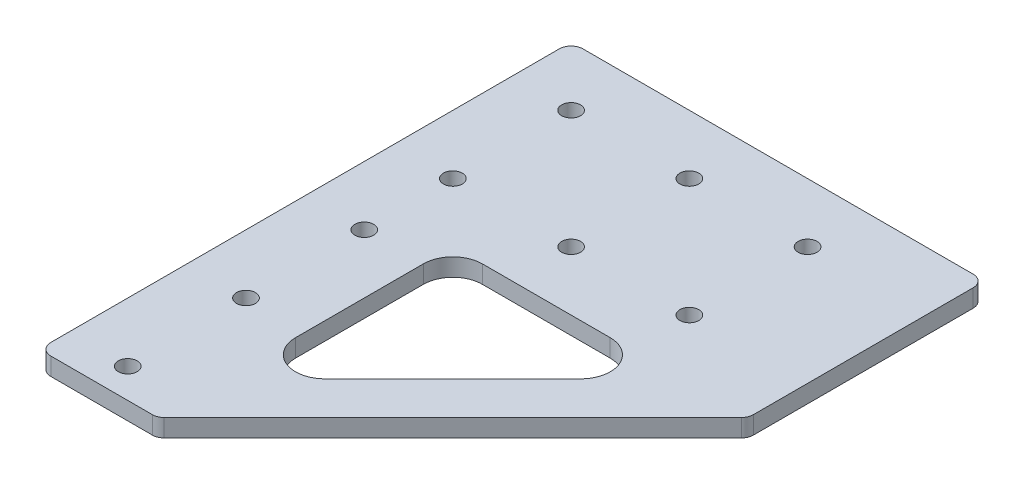
ISO-10303-21;
HEADER;
FILE_DESCRIPTION(('STEP AP214'),'2;1');
FILE_NAME('part.step','',(''),(''),'','','');
FILE_SCHEMA(('AUTOMOTIVE_DESIGN { 1 0 10303 214 1 1 1 1 }'));
ENDSEC;
DATA;
#1=APPLICATION_CONTEXT('core data for automotive mechanical design processes');
#2=APPLICATION_PROTOCOL_DEFINITION('international standard','automotive_design',2000,#1);
#3=PRODUCT_CONTEXT('',#1,'mechanical');
#4=PRODUCT('Part','Part','',(#3));
#5=PRODUCT_RELATED_PRODUCT_CATEGORY('part','',(#4));
#6=PRODUCT_DEFINITION_FORMATION('','',#4);
#7=PRODUCT_DEFINITION_CONTEXT('part definition',#1,'design');
#8=PRODUCT_DEFINITION('design','',#6,#7);
#9=PRODUCT_DEFINITION_SHAPE('','',#8);
#10=(LENGTH_UNIT() NAMED_UNIT(*) SI_UNIT(.MILLI.,.METRE.));
#11=(NAMED_UNIT(*) PLANE_ANGLE_UNIT() SI_UNIT($,.RADIAN.));
#12=(NAMED_UNIT(*) SI_UNIT($,.STERADIAN.) SOLID_ANGLE_UNIT());
#13=UNCERTAINTY_MEASURE_WITH_UNIT(LENGTH_MEASURE(1.E-05),#10,'distance_accuracy_value','');
#14=(GEOMETRIC_REPRESENTATION_CONTEXT(3) GLOBAL_UNCERTAINTY_ASSIGNED_CONTEXT((#13)) GLOBAL_UNIT_ASSIGNED_CONTEXT((#10,
#11,#12)) REPRESENTATION_CONTEXT('',''));
#15=CARTESIAN_POINT('',(0.,0.,0.));
#16=DIRECTION('',(0.,0.,1.));
#17=DIRECTION('',(1.,0.,0.));
#18=AXIS2_PLACEMENT_3D('',#15,#16,#17);
#19=CARTESIAN_POINT('',(0.,3.,0.));
#20=DIRECTION('',(0.,-1.,0.));
#21=DIRECTION('',(0.,0.,-1.));
#22=AXIS2_PLACEMENT_3D('',#19,#20,#21);
#23=PLANE('',#22);
#24=DIRECTION('',(0.,0.,1.));
#25=VECTOR('',#24,1.);
#26=CARTESIAN_POINT('',(-20.,3.,50.));
#27=LINE('',#26,#25);
#28=CARTESIAN_POINT('',(-20.,3.,-38.));
#29=VERTEX_POINT('',#28);
#30=CARTESIAN_POINT('',(-20.,3.,48.));
#31=VERTEX_POINT('',#30);
#32=EDGE_CURVE('E289',#29,#31,#27,.T.);
#33=ORIENTED_EDGE('',*,*,#32,.T.);
#34=CARTESIAN_POINT('',(-18.,3.,48.));
#35=DIRECTION('',(0.,-1.,0.));
#36=DIRECTION('',(0.,0.,-1.));
#37=AXIS2_PLACEMENT_3D('',#34,#35,#36);
#38=CIRCLE('',#37,2.);
#39=CARTESIAN_POINT('',(-18.,3.,50.));
#40=VERTEX_POINT('',#39);
#41=EDGE_CURVE('E213',#31,#40,#38,.F.);
#42=ORIENTED_EDGE('',*,*,#41,.T.);
#43=DIRECTION('',(1.,0.,0.));
#44=VECTOR('',#43,1.);
#45=CARTESIAN_POINT('',(0.,3.,50.));
#46=LINE('',#45,#44);
#47=CARTESIAN_POINT('',(-0.828427124746185,3.,50.));
#48=VERTEX_POINT('',#47);
#49=EDGE_CURVE('E178',#40,#48,#46,.T.);
#50=ORIENTED_EDGE('',*,*,#49,.T.);
#51=CARTESIAN_POINT('',(-0.828427124746185,3.,48.));
#52=DIRECTION('',(0.,-1.,0.));
#53=DIRECTION('',(0.,0.,-1.));
#54=AXIS2_PLACEMENT_3D('',#51,#52,#53);
#55=CIRCLE('',#54,2.);
#56=CARTESIAN_POINT('',(0.585786437626911,3.,49.4142135623731));
#57=VERTEX_POINT('',#56);
#58=EDGE_CURVE('E205',#48,#57,#55,.F.);
#59=ORIENTED_EDGE('',*,*,#58,.T.);
#60=DIRECTION('',(0.707106781186547,0.,-0.707106781186548));
#61=VECTOR('',#60,1.);
#62=CARTESIAN_POINT('',(0.,3.,50.));
#63=LINE('',#62,#61);
#64=CARTESIAN_POINT('',(49.4142135623731,3.,0.585786437626919));
#65=VERTEX_POINT('',#64);
#66=EDGE_CURVE('E185',#57,#65,#63,.T.);
#67=ORIENTED_EDGE('',*,*,#66,.T.);
#68=CARTESIAN_POINT('',(48.,3.,-0.828427124746178));
#69=DIRECTION('',(0.,-1.,0.));
#70=DIRECTION('',(0.,0.,-1.));
#71=AXIS2_PLACEMENT_3D('',#68,#69,#70);
#72=CIRCLE('',#71,2.);
#73=CARTESIAN_POINT('',(50.,3.,-0.828427124746178));
#74=VERTEX_POINT('',#73);
#75=EDGE_CURVE('E207',#65,#74,#72,.F.);
#76=ORIENTED_EDGE('',*,*,#75,.T.);
#77=DIRECTION('',(0.,0.,-1.));
#78=VECTOR('',#77,1.);
#79=CARTESIAN_POINT('',(50.,3.,-40.));
#80=LINE('',#79,#78);
#81=CARTESIAN_POINT('',(50.,3.,-38.));
#82=VERTEX_POINT('',#81);
#83=EDGE_CURVE('E189',#74,#82,#80,.T.);
#84=ORIENTED_EDGE('',*,*,#83,.T.);
#85=CARTESIAN_POINT('',(48.,3.,-38.));
#86=DIRECTION('',(0.,-1.,0.));
#87=DIRECTION('',(0.,0.,-1.));
#88=AXIS2_PLACEMENT_3D('',#85,#86,#87);
#89=CIRCLE('',#88,2.);
#90=CARTESIAN_POINT('',(48.,3.,-40.));
#91=VERTEX_POINT('',#90);
#92=EDGE_CURVE('E209',#82,#91,#89,.F.);
#93=ORIENTED_EDGE('',*,*,#92,.T.);
#94=DIRECTION('',(-1.,0.,0.));
#95=VECTOR('',#94,1.);
#96=CARTESIAN_POINT('',(-20.,3.,-40.));
#97=LINE('',#96,#95);
#98=CARTESIAN_POINT('',(-18.,3.,-40.));
#99=VERTEX_POINT('',#98);
#100=EDGE_CURVE('E286',#91,#99,#97,.T.);
#101=ORIENTED_EDGE('',*,*,#100,.T.);
#102=CARTESIAN_POINT('',(-18.,3.,-38.));
#103=DIRECTION('',(0.,-1.,0.));
#104=DIRECTION('',(0.,0.,-1.));
#105=AXIS2_PLACEMENT_3D('',#102,#103,#104);
#106=CIRCLE('',#105,2.);
#107=EDGE_CURVE('E211',#99,#29,#106,.F.);
#108=ORIENTED_EDGE('',*,*,#107,.T.);
#109=EDGE_LOOP('',(#33,#42,#50,#59,#67,#76,#84,#93,#101,#108));
#110=FACE_BOUND('',#109,.T.);
#111=DIRECTION('',(-1.,0.,0.));
#112=VECTOR('',#111,1.);
#113=CARTESIAN_POINT('',(0.,3.,0.));
#114=LINE('',#113,#112);
#115=CARTESIAN_POINT('',(26.6152236891498,3.,0.));
#116=VERTEX_POINT('',#115);
#117=CARTESIAN_POINT('',(5.,3.,0.));
#118=VERTEX_POINT('',#117);
#119=EDGE_CURVE('E278',#116,#118,#114,.T.);
#120=ORIENTED_EDGE('',*,*,#119,.F.);
#121=CARTESIAN_POINT('',(26.6152236891498,3.,5.));
#122=DIRECTION('',(0.,-1.,0.));
#123=DIRECTION('',(0.,0.,-1.));
#124=AXIS2_PLACEMENT_3D('',#121,#122,#123);
#125=CIRCLE('',#124,5.);
#126=CARTESIAN_POINT('',(30.1507575950825,3.,8.53553390593274));
#127=VERTEX_POINT('',#126);
#128=EDGE_CURVE('E11',#116,#127,#125,.T.);
#129=ORIENTED_EDGE('',*,*,#128,.T.);
#130=DIRECTION('',(0.707106781186547,0.,-0.707106781186548));
#131=VECTOR('',#130,1.);
#132=CARTESIAN_POINT('',(38.6862915010153,3.,0.));
#133=LINE('',#132,#131);
#134=CARTESIAN_POINT('',(8.53553390593274,3.,30.1507575950825));
#135=VERTEX_POINT('',#134);
#136=EDGE_CURVE('E269',#135,#127,#133,.T.);
#137=ORIENTED_EDGE('',*,*,#136,.F.);
#138=CARTESIAN_POINT('',(5.00000000000001,3.,26.6152236891498));
#139=DIRECTION('',(0.,-1.,0.));
#140=DIRECTION('',(0.,0.,-1.));
#141=AXIS2_PLACEMENT_3D('',#138,#139,#140);
#142=CIRCLE('',#141,5.);
#143=CARTESIAN_POINT('',(0.,3.,26.6152236891498));
#144=VERTEX_POINT('',#143);
#145=EDGE_CURVE('E250',#135,#144,#142,.T.);
#146=ORIENTED_EDGE('',*,*,#145,.T.);
#147=DIRECTION('',(0.,0.,1.));
#148=VECTOR('',#147,1.);
#149=CARTESIAN_POINT('',(0.,3.,38.6862915010153));
#150=LINE('',#149,#148);
#151=CARTESIAN_POINT('',(0.,3.,5.));
#152=VERTEX_POINT('',#151);
#153=EDGE_CURVE('E272',#152,#144,#150,.T.);
#154=ORIENTED_EDGE('',*,*,#153,.F.);
#155=CARTESIAN_POINT('',(5.,3.,5.));
#156=DIRECTION('',(0.,-1.,0.));
#157=DIRECTION('',(0.,0.,-1.));
#158=AXIS2_PLACEMENT_3D('',#155,#156,#157);
#159=CIRCLE('',#158,5.);
#160=EDGE_CURVE('E246',#152,#118,#159,.T.);
#161=ORIENTED_EDGE('',*,*,#160,.T.);
#162=EDGE_LOOP('',(#120,#129,#137,#146,#154,#161));
#163=FACE_BOUND('',#162,.T.);
#164=CARTESIAN_POINT('',(-10.,3.,5.));
#165=DIRECTION('',(0.,1.,0.));
#166=DIRECTION('',(0.,0.,1.));
#167=AXIS2_PLACEMENT_3D('',#164,#165,#166);
#168=CIRCLE('',#167,1.6);
#169=CARTESIAN_POINT('',(-10.,3.,6.6));
#170=VERTEX_POINT('',#169);
#171=EDGE_CURVE('E266',#170,#170,#168,.T.);
#172=ORIENTED_EDGE('',*,*,#171,.F.);
#173=EDGE_LOOP('',(#172));
#174=FACE_BOUND('',#173,.T.);
#175=CARTESIAN_POINT('',(-10.,3.,-9.99999999999999));
#176=DIRECTION('',(0.,1.,0.));
#177=DIRECTION('',(0.,0.,1.));
#178=AXIS2_PLACEMENT_3D('',#175,#176,#177);
#179=CIRCLE('',#178,1.6);
#180=CARTESIAN_POINT('',(-10.,3.,-8.39999999999999));
#181=VERTEX_POINT('',#180);
#182=EDGE_CURVE('E424',#181,#181,#179,.T.);
#183=ORIENTED_EDGE('',*,*,#182,.F.);
#184=EDGE_LOOP('',(#183));
#185=FACE_BOUND('',#184,.T.);
#186=CARTESIAN_POINT('',(-10.,3.,25.));
#187=DIRECTION('',(0.,1.,0.));
#188=DIRECTION('',(0.,0.,1.));
#189=AXIS2_PLACEMENT_3D('',#186,#187,#188);
#190=CIRCLE('',#189,1.6);
#191=CARTESIAN_POINT('',(-10.,3.,26.6));
#192=VERTEX_POINT('',#191);
#193=EDGE_CURVE('E418',#192,#192,#190,.T.);
#194=ORIENTED_EDGE('',*,*,#193,.F.);
#195=EDGE_LOOP('',(#194));
#196=FACE_BOUND('',#195,.T.);
#197=CARTESIAN_POINT('',(-10.,3.,45.));
#198=DIRECTION('',(0.,1.,0.));
#199=DIRECTION('',(0.,0.,1.));
#200=AXIS2_PLACEMENT_3D('',#197,#198,#199);
#201=CIRCLE('',#200,1.6);
#202=CARTESIAN_POINT('',(-10.,3.,46.6));
#203=VERTEX_POINT('',#202);
#204=EDGE_CURVE('E412',#203,#203,#201,.T.);
#205=ORIENTED_EDGE('',*,*,#204,.F.);
#206=EDGE_LOOP('',(#205));
#207=FACE_BOUND('',#206,.T.);
#208=CARTESIAN_POINT('',(-10.,3.,-30.));
#209=DIRECTION('',(0.,1.,0.));
#210=DIRECTION('',(0.,0.,1.));
#211=AXIS2_PLACEMENT_3D('',#208,#209,#210);
#212=CIRCLE('',#211,1.6);
#213=CARTESIAN_POINT('',(-10.,3.,-28.4));
#214=VERTEX_POINT('',#213);
#215=EDGE_CURVE('E406',#214,#214,#212,.T.);
#216=ORIENTED_EDGE('',*,*,#215,.F.);
#217=EDGE_LOOP('',(#216));
#218=FACE_BOUND('',#217,.T.);
#219=CARTESIAN_POINT('',(10.,3.,-9.99999999999999));
#220=DIRECTION('',(0.,1.,0.));
#221=DIRECTION('',(0.,0.,1.));
#222=AXIS2_PLACEMENT_3D('',#219,#220,#221);
#223=CIRCLE('',#222,1.6);
#224=CARTESIAN_POINT('',(10.,3.,-8.39999999999999));
#225=VERTEX_POINT('',#224);
#226=EDGE_CURVE('E400',#225,#225,#223,.T.);
#227=ORIENTED_EDGE('',*,*,#226,.F.);
#228=EDGE_LOOP('',(#227));
#229=FACE_BOUND('',#228,.T.);
#230=CARTESIAN_POINT('',(10.,3.,-30.));
#231=DIRECTION('',(0.,1.,0.));
#232=DIRECTION('',(0.,0.,1.));
#233=AXIS2_PLACEMENT_3D('',#230,#231,#232);
#234=CIRCLE('',#233,1.6);
#235=CARTESIAN_POINT('',(10.,3.,-28.4));
#236=VERTEX_POINT('',#235);
#237=EDGE_CURVE('E394',#236,#236,#234,.T.);
#238=ORIENTED_EDGE('',*,*,#237,.F.);
#239=EDGE_LOOP('',(#238));
#240=FACE_BOUND('',#239,.T.);
#241=CARTESIAN_POINT('',(30.,3.,-9.99999999999999));
#242=DIRECTION('',(0.,1.,0.));
#243=DIRECTION('',(0.,0.,1.));
#244=AXIS2_PLACEMENT_3D('',#241,#242,#243);
#245=CIRCLE('',#244,1.6);
#246=CARTESIAN_POINT('',(30.,3.,-8.4));
#247=VERTEX_POINT('',#246);
#248=EDGE_CURVE('E388',#247,#247,#245,.T.);
#249=ORIENTED_EDGE('',*,*,#248,.F.);
#250=EDGE_LOOP('',(#249));
#251=FACE_BOUND('',#250,.T.);
#252=CARTESIAN_POINT('',(30.,3.,-30.));
#253=DIRECTION('',(0.,1.,0.));
#254=DIRECTION('',(0.,0.,1.));
#255=AXIS2_PLACEMENT_3D('',#252,#253,#254);
#256=CIRCLE('',#255,1.6);
#257=CARTESIAN_POINT('',(30.,3.,-28.4));
#258=VERTEX_POINT('',#257);
#259=EDGE_CURVE('E379',#258,#258,#256,.T.);
#260=ORIENTED_EDGE('',*,*,#259,.F.);
#261=EDGE_LOOP('',(#260));
#262=FACE_BOUND('',#261,.T.);
#263=ADVANCED_FACE('F45',(#110,#163,#174,#185,#196,#207,#218,#229,#240,#251,#262),#23,.F.);
#264=CARTESIAN_POINT('',(0.,0.,0.));
#265=DIRECTION('',(0.,-1.,0.));
#266=DIRECTION('',(0.,0.,-1.));
#267=AXIS2_PLACEMENT_3D('',#264,#265,#266);
#268=PLANE('',#267);
#269=CARTESIAN_POINT('',(30.,0.,-9.99999999999999));
#270=DIRECTION('',(0.,1.,0.));
#271=DIRECTION('',(0.,0.,1.));
#272=AXIS2_PLACEMENT_3D('',#269,#270,#271);
#273=CIRCLE('',#272,1.6);
#274=CARTESIAN_POINT('',(30.,0.,-8.4));
#275=VERTEX_POINT('',#274);
#276=EDGE_CURVE('E385',#275,#275,#273,.T.);
#277=ORIENTED_EDGE('',*,*,#276,.T.);
#278=EDGE_LOOP('',(#277));
#279=FACE_BOUND('',#278,.T.);
#280=CARTESIAN_POINT('',(10.,0.,-9.99999999999999));
#281=DIRECTION('',(0.,1.,0.));
#282=DIRECTION('',(0.,0.,1.));
#283=AXIS2_PLACEMENT_3D('',#280,#281,#282);
#284=CIRCLE('',#283,1.6);
#285=CARTESIAN_POINT('',(10.,0.,-8.39999999999999));
#286=VERTEX_POINT('',#285);
#287=EDGE_CURVE('E397',#286,#286,#284,.T.);
#288=ORIENTED_EDGE('',*,*,#287,.T.);
#289=EDGE_LOOP('',(#288));
#290=FACE_BOUND('',#289,.T.);
#291=CARTESIAN_POINT('',(-10.,0.,45.));
#292=DIRECTION('',(0.,1.,0.));
#293=DIRECTION('',(0.,0.,1.));
#294=AXIS2_PLACEMENT_3D('',#291,#292,#293);
#295=CIRCLE('',#294,1.6);
#296=CARTESIAN_POINT('',(-10.,0.,46.6));
#297=VERTEX_POINT('',#296);
#298=EDGE_CURVE('E409',#297,#297,#295,.T.);
#299=ORIENTED_EDGE('',*,*,#298,.T.);
#300=EDGE_LOOP('',(#299));
#301=FACE_BOUND('',#300,.T.);
#302=CARTESIAN_POINT('',(-10.,0.,-9.99999999999999));
#303=DIRECTION('',(0.,1.,0.));
#304=DIRECTION('',(0.,0.,1.));
#305=AXIS2_PLACEMENT_3D('',#302,#303,#304);
#306=CIRCLE('',#305,1.6);
#307=CARTESIAN_POINT('',(-10.,0.,-8.39999999999999));
#308=VERTEX_POINT('',#307);
#309=EDGE_CURVE('E421',#308,#308,#306,.T.);
#310=ORIENTED_EDGE('',*,*,#309,.T.);
#311=EDGE_LOOP('',(#310));
#312=FACE_BOUND('',#311,.T.);
#313=DIRECTION('',(0.,0.,1.));
#314=VECTOR('',#313,1.);
#315=CARTESIAN_POINT('',(0.,0.,38.6862915010153));
#316=LINE('',#315,#314);
#317=CARTESIAN_POINT('',(0.,0.,5.));
#318=VERTEX_POINT('',#317);
#319=CARTESIAN_POINT('',(0.,0.,26.6152236891498));
#320=VERTEX_POINT('',#319);
#321=EDGE_CURVE('E265',#318,#320,#316,.T.);
#322=ORIENTED_EDGE('',*,*,#321,.T.);
#323=CARTESIAN_POINT('',(5.00000000000001,0.,26.6152236891498));
#324=DIRECTION('',(0.,-1.,0.));
#325=DIRECTION('',(0.,0.,-1.));
#326=AXIS2_PLACEMENT_3D('',#323,#324,#325);
#327=CIRCLE('',#326,5.);
#328=CARTESIAN_POINT('',(8.53553390593274,0.,30.1507575950825));
#329=VERTEX_POINT('',#328);
#330=EDGE_CURVE('E248',#320,#329,#327,.F.);
#331=ORIENTED_EDGE('',*,*,#330,.T.);
#332=DIRECTION('',(0.707106781186547,0.,-0.707106781186548));
#333=VECTOR('',#332,1.);
#334=CARTESIAN_POINT('',(38.6862915010153,0.,0.));
#335=LINE('',#334,#333);
#336=CARTESIAN_POINT('',(30.1507575950825,0.,8.53553390593274));
#337=VERTEX_POINT('',#336);
#338=EDGE_CURVE('E257',#329,#337,#335,.T.);
#339=ORIENTED_EDGE('',*,*,#338,.T.);
#340=CARTESIAN_POINT('',(26.6152236891498,0.,5.));
#341=DIRECTION('',(0.,-1.,0.));
#342=DIRECTION('',(0.,0.,-1.));
#343=AXIS2_PLACEMENT_3D('',#340,#341,#342);
#344=CIRCLE('',#343,5.);
#345=CARTESIAN_POINT('',(26.6152236891498,0.,0.));
#346=VERTEX_POINT('',#345);
#347=EDGE_CURVE('E53',#337,#346,#344,.F.);
#348=ORIENTED_EDGE('',*,*,#347,.T.);
#349=DIRECTION('',(-1.,0.,0.));
#350=VECTOR('',#349,1.);
#351=CARTESIAN_POINT('',(0.,0.,0.));
#352=LINE('',#351,#350);
#353=CARTESIAN_POINT('',(5.,0.,0.));
#354=VERTEX_POINT('',#353);
#355=EDGE_CURVE('E256',#346,#354,#352,.T.);
#356=ORIENTED_EDGE('',*,*,#355,.T.);
#357=CARTESIAN_POINT('',(5.,0.,5.));
#358=DIRECTION('',(0.,-1.,0.));
#359=DIRECTION('',(0.,0.,-1.));
#360=AXIS2_PLACEMENT_3D('',#357,#358,#359);
#361=CIRCLE('',#360,5.);
#362=EDGE_CURVE('E244',#354,#318,#361,.F.);
#363=ORIENTED_EDGE('',*,*,#362,.T.);
#364=EDGE_LOOP('',(#322,#331,#339,#348,#356,#363));
#365=FACE_BOUND('',#364,.T.);
#366=DIRECTION('',(1.,0.,0.));
#367=VECTOR('',#366,1.);
#368=CARTESIAN_POINT('',(0.,0.,50.));
#369=LINE('',#368,#367);
#370=CARTESIAN_POINT('',(-18.,0.,50.));
#371=VERTEX_POINT('',#370);
#372=CARTESIAN_POINT('',(-0.828427124746185,0.,50.));
#373=VERTEX_POINT('',#372);
#374=EDGE_CURVE('E175',#371,#373,#369,.T.);
#375=ORIENTED_EDGE('',*,*,#374,.F.);
#376=CARTESIAN_POINT('',(-18.,0.,48.));
#377=DIRECTION('',(0.,-1.,0.));
#378=DIRECTION('',(0.,0.,-1.));
#379=AXIS2_PLACEMENT_3D('',#376,#377,#378);
#380=CIRCLE('',#379,2.);
#381=CARTESIAN_POINT('',(-20.,0.,48.));
#382=VERTEX_POINT('',#381);
#383=EDGE_CURVE('E158',#371,#382,#380,.T.);
#384=ORIENTED_EDGE('',*,*,#383,.T.);
#385=DIRECTION('',(0.,0.,1.));
#386=VECTOR('',#385,1.);
#387=CARTESIAN_POINT('',(-20.,0.,50.));
#388=LINE('',#387,#386);
#389=CARTESIAN_POINT('',(-20.,0.,-38.));
#390=VERTEX_POINT('',#389);
#391=EDGE_CURVE('E186',#390,#382,#388,.T.);
#392=ORIENTED_EDGE('',*,*,#391,.F.);
#393=CARTESIAN_POINT('',(-18.,0.,-38.));
#394=DIRECTION('',(0.,-1.,0.));
#395=DIRECTION('',(0.,0.,-1.));
#396=AXIS2_PLACEMENT_3D('',#393,#394,#395);
#397=CIRCLE('',#396,2.);
#398=CARTESIAN_POINT('',(-18.,0.,-40.));
#399=VERTEX_POINT('',#398);
#400=EDGE_CURVE('E169',#390,#399,#397,.T.);
#401=ORIENTED_EDGE('',*,*,#400,.T.);
#402=DIRECTION('',(-1.,0.,0.));
#403=VECTOR('',#402,1.);
#404=CARTESIAN_POINT('',(-20.,0.,-40.));
#405=LINE('',#404,#403);
#406=CARTESIAN_POINT('',(48.,0.,-40.));
#407=VERTEX_POINT('',#406);
#408=EDGE_CURVE('E191',#407,#399,#405,.T.);
#409=ORIENTED_EDGE('',*,*,#408,.F.);
#410=CARTESIAN_POINT('',(48.,0.,-38.));
#411=DIRECTION('',(0.,-1.,0.));
#412=DIRECTION('',(0.,0.,-1.));
#413=AXIS2_PLACEMENT_3D('',#410,#411,#412);
#414=CIRCLE('',#413,2.);
#415=CARTESIAN_POINT('',(50.,0.,-38.));
#416=VERTEX_POINT('',#415);
#417=EDGE_CURVE('E199',#407,#416,#414,.T.);
#418=ORIENTED_EDGE('',*,*,#417,.T.);
#419=DIRECTION('',(0.,0.,-1.));
#420=VECTOR('',#419,1.);
#421=CARTESIAN_POINT('',(50.,0.,-40.));
#422=LINE('',#421,#420);
#423=CARTESIAN_POINT('',(50.,0.,-0.828427124746178));
#424=VERTEX_POINT('',#423);
#425=EDGE_CURVE('E275',#424,#416,#422,.T.);
#426=ORIENTED_EDGE('',*,*,#425,.F.);
#427=CARTESIAN_POINT('',(48.,0.,-0.828427124746178));
#428=DIRECTION('',(0.,-1.,0.));
#429=DIRECTION('',(0.,0.,-1.));
#430=AXIS2_PLACEMENT_3D('',#427,#428,#429);
#431=CIRCLE('',#430,2.);
#432=CARTESIAN_POINT('',(49.4142135623731,0.,0.585786437626919));
#433=VERTEX_POINT('',#432);
#434=EDGE_CURVE('E197',#424,#433,#431,.T.);
#435=ORIENTED_EDGE('',*,*,#434,.T.);
#436=DIRECTION('',(0.707106781186547,0.,-0.707106781186548));
#437=VECTOR('',#436,1.);
#438=CARTESIAN_POINT('',(0.,0.,50.));
#439=LINE('',#438,#437);
#440=CARTESIAN_POINT('',(0.585786437626911,0.,49.4142135623731));
#441=VERTEX_POINT('',#440);
#442=EDGE_CURVE('E271',#441,#433,#439,.T.);
#443=ORIENTED_EDGE('',*,*,#442,.F.);
#444=CARTESIAN_POINT('',(-0.828427124746185,0.,48.));
#445=DIRECTION('',(0.,-1.,0.));
#446=DIRECTION('',(0.,0.,-1.));
#447=AXIS2_PLACEMENT_3D('',#444,#445,#446);
#448=CIRCLE('',#447,2.);
#449=EDGE_CURVE('E179',#441,#373,#448,.T.);
#450=ORIENTED_EDGE('',*,*,#449,.T.);
#451=EDGE_LOOP('',(#375,#384,#392,#401,#409,#418,#426,#435,#443,#450));
#452=FACE_BOUND('',#451,.T.);
#453=CARTESIAN_POINT('',(-10.,0.,5.));
#454=DIRECTION('',(0.,1.,0.));
#455=DIRECTION('',(0.,0.,1.));
#456=AXIS2_PLACEMENT_3D('',#453,#454,#455);
#457=CIRCLE('',#456,1.6);
#458=CARTESIAN_POINT('',(-10.,0.,6.6));
#459=VERTEX_POINT('',#458);
#460=EDGE_CURVE('E427',#459,#459,#457,.T.);
#461=ORIENTED_EDGE('',*,*,#460,.T.);
#462=EDGE_LOOP('',(#461));
#463=FACE_BOUND('',#462,.T.);
#464=CARTESIAN_POINT('',(-10.,0.,25.));
#465=DIRECTION('',(0.,1.,0.));
#466=DIRECTION('',(0.,0.,1.));
#467=AXIS2_PLACEMENT_3D('',#464,#465,#466);
#468=CIRCLE('',#467,1.6);
#469=CARTESIAN_POINT('',(-10.,0.,26.6));
#470=VERTEX_POINT('',#469);
#471=EDGE_CURVE('E415',#470,#470,#468,.T.);
#472=ORIENTED_EDGE('',*,*,#471,.T.);
#473=EDGE_LOOP('',(#472));
#474=FACE_BOUND('',#473,.T.);
#475=CARTESIAN_POINT('',(-10.,0.,-30.));
#476=DIRECTION('',(0.,1.,0.));
#477=DIRECTION('',(0.,0.,1.));
#478=AXIS2_PLACEMENT_3D('',#475,#476,#477);
#479=CIRCLE('',#478,1.6);
#480=CARTESIAN_POINT('',(-10.,0.,-28.4));
#481=VERTEX_POINT('',#480);
#482=EDGE_CURVE('E403',#481,#481,#479,.T.);
#483=ORIENTED_EDGE('',*,*,#482,.T.);
#484=EDGE_LOOP('',(#483));
#485=FACE_BOUND('',#484,.T.);
#486=CARTESIAN_POINT('',(10.,0.,-30.));
#487=DIRECTION('',(0.,1.,0.));
#488=DIRECTION('',(0.,0.,1.));
#489=AXIS2_PLACEMENT_3D('',#486,#487,#488);
#490=CIRCLE('',#489,1.6);
#491=CARTESIAN_POINT('',(10.,0.,-28.4));
#492=VERTEX_POINT('',#491);
#493=EDGE_CURVE('E391',#492,#492,#490,.T.);
#494=ORIENTED_EDGE('',*,*,#493,.T.);
#495=EDGE_LOOP('',(#494));
#496=FACE_BOUND('',#495,.T.);
#497=CARTESIAN_POINT('',(30.,0.,-30.));
#498=DIRECTION('',(0.,1.,0.));
#499=DIRECTION('',(0.,0.,1.));
#500=AXIS2_PLACEMENT_3D('',#497,#498,#499);
#501=CIRCLE('',#500,1.6);
#502=CARTESIAN_POINT('',(30.,0.,-28.4));
#503=VERTEX_POINT('',#502);
#504=EDGE_CURVE('E382',#503,#503,#501,.T.);
#505=ORIENTED_EDGE('',*,*,#504,.T.);
#506=EDGE_LOOP('',(#505));
#507=FACE_BOUND('',#506,.T.);
#508=ADVANCED_FACE('F182',(#279,#290,#301,#312,#365,#452,#463,#474,#485,#496,#507),#268,.T.);
#509=CARTESIAN_POINT('',(0.,3.,50.));
#510=DIRECTION('',(-0.707106781186548,0.,-0.707106781186547));
#511=DIRECTION('',(-0.707106781186547,0.,0.707106781186548));
#512=AXIS2_PLACEMENT_3D('',#509,#510,#511);
#513=PLANE('',#512);
#514=ORIENTED_EDGE('',*,*,#442,.T.);
#515=DIRECTION('',(0.,-1.,0.));
#516=VECTOR('',#515,1.);
#517=CARTESIAN_POINT('',(49.4142135623731,3.,0.585786437626919));
#518=LINE('',#517,#516);
#519=EDGE_CURVE('E228',#433,#65,#518,.F.);
#520=ORIENTED_EDGE('',*,*,#519,.T.);
#521=ORIENTED_EDGE('',*,*,#66,.F.);
#522=DIRECTION('',(0.,-1.,0.));
#523=VECTOR('',#522,1.);
#524=CARTESIAN_POINT('',(0.585786437626911,3.,49.4142135623731));
#525=LINE('',#524,#523);
#526=EDGE_CURVE('E225',#57,#441,#525,.T.);
#527=ORIENTED_EDGE('',*,*,#526,.T.);
#528=EDGE_LOOP('',(#514,#520,#521,#527));
#529=FACE_BOUND('',#528,.T.);
#530=ADVANCED_FACE('F324',(#529),#513,.F.);
#531=CARTESIAN_POINT('',(50.,3.,-40.));
#532=DIRECTION('',(-1.,0.,0.));
#533=DIRECTION('',(0.,0.,1.));
#534=AXIS2_PLACEMENT_3D('',#531,#532,#533);
#535=PLANE('',#534);
#536=ORIENTED_EDGE('',*,*,#425,.T.);
#537=DIRECTION('',(0.,-1.,0.));
#538=VECTOR('',#537,1.);
#539=CARTESIAN_POINT('',(50.,3.,-38.));
#540=LINE('',#539,#538);
#541=EDGE_CURVE('E223',#416,#82,#540,.F.);
#542=ORIENTED_EDGE('',*,*,#541,.T.);
#543=ORIENTED_EDGE('',*,*,#83,.F.);
#544=DIRECTION('',(0.,-1.,0.));
#545=VECTOR('',#544,1.);
#546=CARTESIAN_POINT('',(50.,3.,-0.828427124746178));
#547=LINE('',#546,#545);
#548=EDGE_CURVE('E220',#74,#424,#547,.T.);
#549=ORIENTED_EDGE('',*,*,#548,.T.);
#550=EDGE_LOOP('',(#536,#542,#543,#549));
#551=FACE_BOUND('',#550,.T.);
#552=ADVANCED_FACE('F316',(#551),#535,.F.);
#553=CARTESIAN_POINT('',(-20.,3.,-40.));
#554=DIRECTION('',(0.,0.,1.));
#555=DIRECTION('',(1.,0.,0.));
#556=AXIS2_PLACEMENT_3D('',#553,#554,#555);
#557=PLANE('',#556);
#558=ORIENTED_EDGE('',*,*,#408,.T.);
#559=DIRECTION('',(0.,-1.,0.));
#560=VECTOR('',#559,1.);
#561=CARTESIAN_POINT('',(-18.,3.,-40.));
#562=LINE('',#561,#560);
#563=EDGE_CURVE('E218',#399,#99,#562,.F.);
#564=ORIENTED_EDGE('',*,*,#563,.T.);
#565=ORIENTED_EDGE('',*,*,#100,.F.);
#566=DIRECTION('',(0.,-1.,0.));
#567=VECTOR('',#566,1.);
#568=CARTESIAN_POINT('',(48.,3.,-40.));
#569=LINE('',#568,#567);
#570=EDGE_CURVE('E215',#91,#407,#569,.T.);
#571=ORIENTED_EDGE('',*,*,#570,.T.);
#572=EDGE_LOOP('',(#558,#564,#565,#571));
#573=FACE_BOUND('',#572,.T.);
#574=ADVANCED_FACE('F298',(#573),#557,.F.);
#575=CARTESIAN_POINT('',(-20.,3.,50.));
#576=DIRECTION('',(1.,0.,0.));
#577=DIRECTION('',(0.,0.,-1.));
#578=AXIS2_PLACEMENT_3D('',#575,#576,#577);
#579=PLANE('',#578);
#580=ORIENTED_EDGE('',*,*,#391,.T.);
#581=DIRECTION('',(0.,-1.,0.));
#582=VECTOR('',#581,1.);
#583=CARTESIAN_POINT('',(-20.,3.,48.));
#584=LINE('',#583,#582);
#585=EDGE_CURVE('E163',#382,#31,#584,.F.);
#586=ORIENTED_EDGE('',*,*,#585,.T.);
#587=ORIENTED_EDGE('',*,*,#32,.F.);
#588=DIRECTION('',(0.,-1.,0.));
#589=VECTOR('',#588,1.);
#590=CARTESIAN_POINT('',(-20.,3.,-38.));
#591=LINE('',#590,#589);
#592=EDGE_CURVE('E168',#29,#390,#591,.T.);
#593=ORIENTED_EDGE('',*,*,#592,.T.);
#594=EDGE_LOOP('',(#580,#586,#587,#593));
#595=FACE_BOUND('',#594,.T.);
#596=ADVANCED_FACE('F308',(#595),#579,.F.);
#597=CARTESIAN_POINT('',(0.,3.,50.));
#598=DIRECTION('',(0.,0.,-1.));
#599=DIRECTION('',(-1.,0.,0.));
#600=AXIS2_PLACEMENT_3D('',#597,#598,#599);
#601=PLANE('',#600);
#602=ORIENTED_EDGE('',*,*,#49,.F.);
#603=DIRECTION('',(0.,-1.,0.));
#604=VECTOR('',#603,1.);
#605=CARTESIAN_POINT('',(-18.,3.,50.));
#606=LINE('',#605,#604);
#607=EDGE_CURVE('E162',#40,#371,#606,.T.);
#608=ORIENTED_EDGE('',*,*,#607,.T.);
#609=ORIENTED_EDGE('',*,*,#374,.T.);
#610=DIRECTION('',(0.,-1.,0.));
#611=VECTOR('',#610,1.);
#612=CARTESIAN_POINT('',(-0.828427124746185,3.,50.));
#613=LINE('',#612,#611);
#614=EDGE_CURVE('E180',#373,#48,#613,.F.);
#615=ORIENTED_EDGE('',*,*,#614,.T.);
#616=EDGE_LOOP('',(#602,#608,#609,#615));
#617=FACE_BOUND('',#616,.T.);
#618=ADVANCED_FACE('F174',(#617),#601,.F.);
#619=CARTESIAN_POINT('',(0.,3.,0.));
#620=DIRECTION('',(0.,0.,1.));
#621=DIRECTION('',(1.,0.,0.));
#622=AXIS2_PLACEMENT_3D('',#619,#620,#621);
#623=PLANE('',#622);
#624=ORIENTED_EDGE('',*,*,#119,.T.);
#625=DIRECTION('',(0.,-1.,0.));
#626=VECTOR('',#625,1.);
#627=CARTESIAN_POINT('',(5.,0.,0.));
#628=LINE('',#627,#626);
#629=EDGE_CURVE('E232',#118,#354,#628,.T.);
#630=ORIENTED_EDGE('',*,*,#629,.T.);
#631=ORIENTED_EDGE('',*,*,#355,.F.);
#632=DIRECTION('',(0.,-1.,0.));
#633=VECTOR('',#632,1.);
#634=CARTESIAN_POINT('',(26.6152236891498,3.,0.));
#635=LINE('',#634,#633);
#636=EDGE_CURVE('E230',#346,#116,#635,.F.);
#637=ORIENTED_EDGE('',*,*,#636,.T.);
#638=EDGE_LOOP('',(#624,#630,#631,#637));
#639=FACE_BOUND('',#638,.T.);
#640=ADVANCED_FACE('F263',(#639),#623,.T.);
#641=CARTESIAN_POINT('',(0.,3.,38.6862915010153));
#642=DIRECTION('',(1.,0.,0.));
#643=DIRECTION('',(0.,0.,-1.));
#644=AXIS2_PLACEMENT_3D('',#641,#642,#643);
#645=PLANE('',#644);
#646=ORIENTED_EDGE('',*,*,#321,.F.);
#647=DIRECTION('',(0.,-1.,0.));
#648=VECTOR('',#647,1.);
#649=CARTESIAN_POINT('',(0.,3.,5.));
#650=LINE('',#649,#648);
#651=EDGE_CURVE('E238',#318,#152,#650,.F.);
#652=ORIENTED_EDGE('',*,*,#651,.T.);
#653=ORIENTED_EDGE('',*,*,#153,.T.);
#654=DIRECTION('',(0.,-1.,0.));
#655=VECTOR('',#654,1.);
#656=CARTESIAN_POINT('',(0.,0.,26.6152236891498));
#657=LINE('',#656,#655);
#658=EDGE_CURVE('E235',#144,#320,#657,.T.);
#659=ORIENTED_EDGE('',*,*,#658,.T.);
#660=EDGE_LOOP('',(#646,#652,#653,#659));
#661=FACE_BOUND('',#660,.T.);
#662=ADVANCED_FACE('F330',(#661),#645,.T.);
#663=CARTESIAN_POINT('',(38.6862915010153,3.,0.));
#664=DIRECTION('',(-0.707106781186548,0.,-0.707106781186547));
#665=DIRECTION('',(-0.707106781186547,0.,0.707106781186548));
#666=AXIS2_PLACEMENT_3D('',#663,#664,#665);
#667=PLANE('',#666);
#668=ORIENTED_EDGE('',*,*,#338,.F.);
#669=DIRECTION('',(0.,-1.,0.));
#670=VECTOR('',#669,1.);
#671=CARTESIAN_POINT('',(8.53553390593274,3.,30.1507575950825));
#672=LINE('',#671,#670);
#673=EDGE_CURVE('E65',#329,#135,#672,.F.);
#674=ORIENTED_EDGE('',*,*,#673,.T.);
#675=ORIENTED_EDGE('',*,*,#136,.T.);
#676=DIRECTION('',(0.,-1.,0.));
#677=VECTOR('',#676,1.);
#678=CARTESIAN_POINT('',(30.1507575950825,0.,8.53553390593274));
#679=LINE('',#678,#677);
#680=EDGE_CURVE('E240',#127,#337,#679,.T.);
#681=ORIENTED_EDGE('',*,*,#680,.T.);
#682=EDGE_LOOP('',(#668,#674,#675,#681));
#683=FACE_BOUND('',#682,.T.);
#684=ADVANCED_FACE('F268',(#683),#667,.T.);
#685=CARTESIAN_POINT('',(-10.,3.,5.));
#686=DIRECTION('',(0.,-1.,0.));
#687=DIRECTION('',(0.,0.,-1.));
#688=AXIS2_PLACEMENT_3D('',#685,#686,#687);
#689=CYLINDRICAL_SURFACE('',#688,1.6);
#690=ORIENTED_EDGE('',*,*,#171,.T.);
#691=EDGE_LOOP('',(#690));
#692=FACE_BOUND('',#691,.T.);
#693=ORIENTED_EDGE('',*,*,#460,.F.);
#694=EDGE_LOOP('',(#693));
#695=FACE_BOUND('',#694,.T.);
#696=ADVANCED_FACE('F336',(#692,#695),#689,.F.);
#697=CARTESIAN_POINT('',(-10.,3.,-9.99999999999999));
#698=DIRECTION('',(0.,-1.,0.));
#699=DIRECTION('',(0.,0.,-1.));
#700=AXIS2_PLACEMENT_3D('',#697,#698,#699);
#701=CYLINDRICAL_SURFACE('',#700,1.6);
#702=ORIENTED_EDGE('',*,*,#182,.T.);
#703=EDGE_LOOP('',(#702));
#704=FACE_BOUND('',#703,.T.);
#705=ORIENTED_EDGE('',*,*,#309,.F.);
#706=EDGE_LOOP('',(#705));
#707=FACE_BOUND('',#706,.T.);
#708=ADVANCED_FACE('F339',(#704,#707),#701,.F.);
#709=CARTESIAN_POINT('',(-10.,3.,25.));
#710=DIRECTION('',(0.,-1.,0.));
#711=DIRECTION('',(0.,0.,-1.));
#712=AXIS2_PLACEMENT_3D('',#709,#710,#711);
#713=CYLINDRICAL_SURFACE('',#712,1.6);
#714=ORIENTED_EDGE('',*,*,#193,.T.);
#715=EDGE_LOOP('',(#714));
#716=FACE_BOUND('',#715,.T.);
#717=ORIENTED_EDGE('',*,*,#471,.F.);
#718=EDGE_LOOP('',(#717));
#719=FACE_BOUND('',#718,.T.);
#720=ADVANCED_FACE('F343',(#716,#719),#713,.F.);
#721=CARTESIAN_POINT('',(-10.,3.,45.));
#722=DIRECTION('',(0.,-1.,0.));
#723=DIRECTION('',(0.,0.,-1.));
#724=AXIS2_PLACEMENT_3D('',#721,#722,#723);
#725=CYLINDRICAL_SURFACE('',#724,1.6);
#726=ORIENTED_EDGE('',*,*,#204,.T.);
#727=EDGE_LOOP('',(#726));
#728=FACE_BOUND('',#727,.T.);
#729=ORIENTED_EDGE('',*,*,#298,.F.);
#730=EDGE_LOOP('',(#729));
#731=FACE_BOUND('',#730,.T.);
#732=ADVANCED_FACE('F347',(#728,#731),#725,.F.);
#733=CARTESIAN_POINT('',(-10.,3.,-30.));
#734=DIRECTION('',(0.,-1.,0.));
#735=DIRECTION('',(0.,0.,-1.));
#736=AXIS2_PLACEMENT_3D('',#733,#734,#735);
#737=CYLINDRICAL_SURFACE('',#736,1.6);
#738=ORIENTED_EDGE('',*,*,#215,.T.);
#739=EDGE_LOOP('',(#738));
#740=FACE_BOUND('',#739,.T.);
#741=ORIENTED_EDGE('',*,*,#482,.F.);
#742=EDGE_LOOP('',(#741));
#743=FACE_BOUND('',#742,.T.);
#744=ADVANCED_FACE('F351',(#740,#743),#737,.F.);
#745=CARTESIAN_POINT('',(10.,3.,-9.99999999999999));
#746=DIRECTION('',(0.,-1.,0.));
#747=DIRECTION('',(0.,0.,-1.));
#748=AXIS2_PLACEMENT_3D('',#745,#746,#747);
#749=CYLINDRICAL_SURFACE('',#748,1.6);
#750=ORIENTED_EDGE('',*,*,#226,.T.);
#751=EDGE_LOOP('',(#750));
#752=FACE_BOUND('',#751,.T.);
#753=ORIENTED_EDGE('',*,*,#287,.F.);
#754=EDGE_LOOP('',(#753));
#755=FACE_BOUND('',#754,.T.);
#756=ADVANCED_FACE('F355',(#752,#755),#749,.F.);
#757=CARTESIAN_POINT('',(10.,3.,-30.));
#758=DIRECTION('',(0.,-1.,0.));
#759=DIRECTION('',(0.,0.,-1.));
#760=AXIS2_PLACEMENT_3D('',#757,#758,#759);
#761=CYLINDRICAL_SURFACE('',#760,1.6);
#762=ORIENTED_EDGE('',*,*,#237,.T.);
#763=EDGE_LOOP('',(#762));
#764=FACE_BOUND('',#763,.T.);
#765=ORIENTED_EDGE('',*,*,#493,.F.);
#766=EDGE_LOOP('',(#765));
#767=FACE_BOUND('',#766,.T.);
#768=ADVANCED_FACE('F359',(#764,#767),#761,.F.);
#769=CARTESIAN_POINT('',(30.,3.,-9.99999999999999));
#770=DIRECTION('',(0.,-1.,0.));
#771=DIRECTION('',(0.,0.,-1.));
#772=AXIS2_PLACEMENT_3D('',#769,#770,#771);
#773=CYLINDRICAL_SURFACE('',#772,1.6);
#774=ORIENTED_EDGE('',*,*,#248,.T.);
#775=EDGE_LOOP('',(#774));
#776=FACE_BOUND('',#775,.T.);
#777=ORIENTED_EDGE('',*,*,#276,.F.);
#778=EDGE_LOOP('',(#777));
#779=FACE_BOUND('',#778,.T.);
#780=ADVANCED_FACE('F363',(#776,#779),#773,.F.);
#781=CARTESIAN_POINT('',(30.,3.,-30.));
#782=DIRECTION('',(0.,-1.,0.));
#783=DIRECTION('',(0.,0.,-1.));
#784=AXIS2_PLACEMENT_3D('',#781,#782,#783);
#785=CYLINDRICAL_SURFACE('',#784,1.6);
#786=ORIENTED_EDGE('',*,*,#259,.T.);
#787=EDGE_LOOP('',(#786));
#788=FACE_BOUND('',#787,.T.);
#789=ORIENTED_EDGE('',*,*,#504,.F.);
#790=EDGE_LOOP('',(#789));
#791=FACE_BOUND('',#790,.T.);
#792=ADVANCED_FACE('F367',(#788,#791),#785,.F.);
#793=CARTESIAN_POINT('',(-18.,3.,48.));
#794=DIRECTION('',(0.,-1.,0.));
#795=DIRECTION('',(0.,0.,-1.));
#796=AXIS2_PLACEMENT_3D('',#793,#794,#795);
#797=CYLINDRICAL_SURFACE('',#796,2.);
#798=ORIENTED_EDGE('',*,*,#41,.F.);
#799=ORIENTED_EDGE('',*,*,#585,.F.);
#800=ORIENTED_EDGE('',*,*,#383,.F.);
#801=ORIENTED_EDGE('',*,*,#607,.F.);
#802=EDGE_LOOP('',(#798,#799,#800,#801));
#803=FACE_BOUND('',#802,.T.);
#804=ADVANCED_FACE('F161',(#803),#797,.T.);
#805=CARTESIAN_POINT('',(-18.,3.,-38.));
#806=DIRECTION('',(0.,-1.,0.));
#807=DIRECTION('',(0.,0.,-1.));
#808=AXIS2_PLACEMENT_3D('',#805,#806,#807);
#809=CYLINDRICAL_SURFACE('',#808,2.);
#810=ORIENTED_EDGE('',*,*,#107,.F.);
#811=ORIENTED_EDGE('',*,*,#563,.F.);
#812=ORIENTED_EDGE('',*,*,#400,.F.);
#813=ORIENTED_EDGE('',*,*,#592,.F.);
#814=EDGE_LOOP('',(#810,#811,#812,#813));
#815=FACE_BOUND('',#814,.T.);
#816=ADVANCED_FACE('F303',(#815),#809,.T.);
#817=CARTESIAN_POINT('',(48.,3.,-38.));
#818=DIRECTION('',(0.,-1.,0.));
#819=DIRECTION('',(0.,0.,-1.));
#820=AXIS2_PLACEMENT_3D('',#817,#818,#819);
#821=CYLINDRICAL_SURFACE('',#820,2.);
#822=ORIENTED_EDGE('',*,*,#92,.F.);
#823=ORIENTED_EDGE('',*,*,#541,.F.);
#824=ORIENTED_EDGE('',*,*,#417,.F.);
#825=ORIENTED_EDGE('',*,*,#570,.F.);
#826=EDGE_LOOP('',(#822,#823,#824,#825));
#827=FACE_BOUND('',#826,.T.);
#828=ADVANCED_FACE('F494',(#827),#821,.T.);
#829=CARTESIAN_POINT('',(48.,3.,-0.828427124746178));
#830=DIRECTION('',(0.,-1.,0.));
#831=DIRECTION('',(0.,0.,-1.));
#832=AXIS2_PLACEMENT_3D('',#829,#830,#831);
#833=CYLINDRICAL_SURFACE('',#832,2.);
#834=ORIENTED_EDGE('',*,*,#75,.F.);
#835=ORIENTED_EDGE('',*,*,#519,.F.);
#836=ORIENTED_EDGE('',*,*,#434,.F.);
#837=ORIENTED_EDGE('',*,*,#548,.F.);
#838=EDGE_LOOP('',(#834,#835,#836,#837));
#839=FACE_BOUND('',#838,.T.);
#840=ADVANCED_FACE('F490',(#839),#833,.T.);
#841=CARTESIAN_POINT('',(-0.828427124746185,3.,48.));
#842=DIRECTION('',(0.,-1.,0.));
#843=DIRECTION('',(0.,0.,-1.));
#844=AXIS2_PLACEMENT_3D('',#841,#842,#843);
#845=CYLINDRICAL_SURFACE('',#844,2.);
#846=ORIENTED_EDGE('',*,*,#58,.F.);
#847=ORIENTED_EDGE('',*,*,#614,.F.);
#848=ORIENTED_EDGE('',*,*,#449,.F.);
#849=ORIENTED_EDGE('',*,*,#526,.F.);
#850=EDGE_LOOP('',(#846,#847,#848,#849));
#851=FACE_BOUND('',#850,.T.);
#852=ADVANCED_FACE('F486',(#851),#845,.T.);
#853=CARTESIAN_POINT('',(5.,3.,5.));
#854=DIRECTION('',(0.,1.,0.));
#855=DIRECTION('',(0.,0.,1.));
#856=AXIS2_PLACEMENT_3D('',#853,#854,#855);
#857=CYLINDRICAL_SURFACE('',#856,5.);
#858=ORIENTED_EDGE('',*,*,#160,.F.);
#859=ORIENTED_EDGE('',*,*,#651,.F.);
#860=ORIENTED_EDGE('',*,*,#362,.F.);
#861=ORIENTED_EDGE('',*,*,#629,.F.);
#862=EDGE_LOOP('',(#858,#859,#860,#861));
#863=FACE_BOUND('',#862,.T.);
#864=ADVANCED_FACE('F435',(#863),#857,.F.);
#865=CARTESIAN_POINT('',(5.00000000000001,3.,26.6152236891498));
#866=DIRECTION('',(0.,1.,0.));
#867=DIRECTION('',(0.,0.,1.));
#868=AXIS2_PLACEMENT_3D('',#865,#866,#867);
#869=CYLINDRICAL_SURFACE('',#868,5.);
#870=ORIENTED_EDGE('',*,*,#145,.F.);
#871=ORIENTED_EDGE('',*,*,#673,.F.);
#872=ORIENTED_EDGE('',*,*,#330,.F.);
#873=ORIENTED_EDGE('',*,*,#658,.F.);
#874=EDGE_LOOP('',(#870,#871,#872,#873));
#875=FACE_BOUND('',#874,.T.);
#876=ADVANCED_FACE('F441',(#875),#869,.F.);
#877=CARTESIAN_POINT('',(26.6152236891498,3.,5.));
#878=DIRECTION('',(0.,1.,0.));
#879=DIRECTION('',(0.,0.,1.));
#880=AXIS2_PLACEMENT_3D('',#877,#878,#879);
#881=CYLINDRICAL_SURFACE('',#880,5.);
#882=ORIENTED_EDGE('',*,*,#128,.F.);
#883=ORIENTED_EDGE('',*,*,#636,.F.);
#884=ORIENTED_EDGE('',*,*,#347,.F.);
#885=ORIENTED_EDGE('',*,*,#680,.F.);
#886=EDGE_LOOP('',(#882,#883,#884,#885));
#887=FACE_BOUND('',#886,.T.);
#888=ADVANCED_FACE('F47',(#887),#881,.F.);
#889=CLOSED_SHELL('',(#263,#508,#530,#552,#574,#596,#618,#640,#662,#684,#696,#708,#720,#732,
#744,#756,#768,#780,#792,#804,#816,#828,#840,#852,#864,#876,#888));
#890=MANIFOLD_SOLID_BREP('B2',#889);
#891=ADVANCED_BREP_SHAPE_REPRESENTATION('',(#18,#890),#14);
#892=SHAPE_DEFINITION_REPRESENTATION(#9,#891);
ENDSEC;
END-ISO-10303-21;
